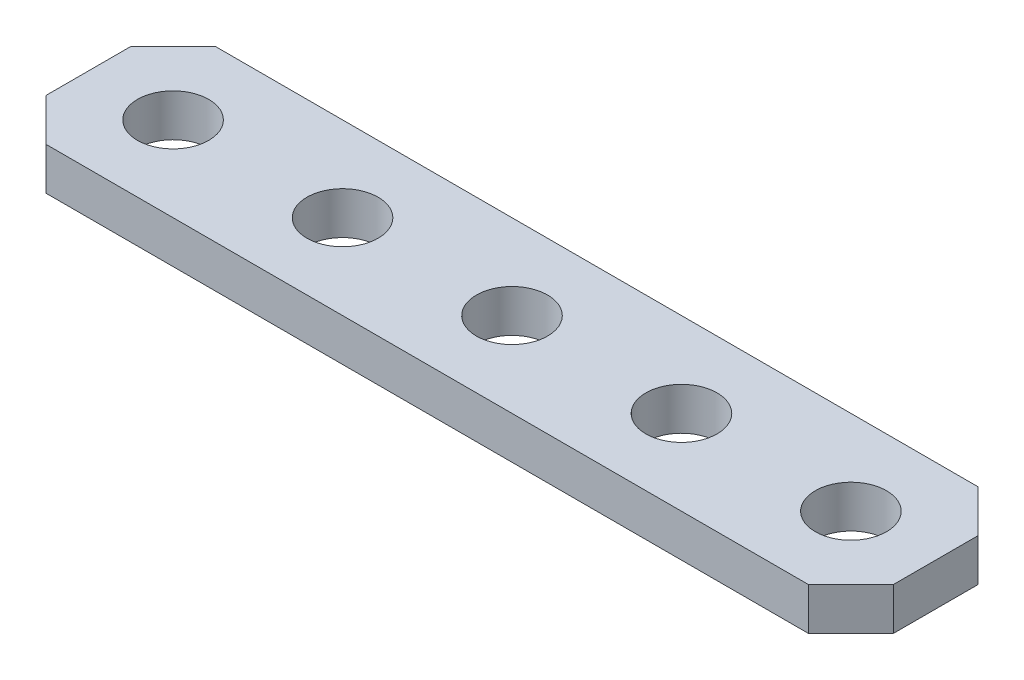
ISO-10303-21;
HEADER;
FILE_DESCRIPTION(('STEP AP214'),'2;1');
FILE_NAME('part.step','',(''),(''),'','','');
FILE_SCHEMA(('AUTOMOTIVE_DESIGN { 1 0 10303 214 1 1 1 1 }'));
ENDSEC;
DATA;
#1=APPLICATION_CONTEXT('core data for automotive mechanical design processes');
#2=APPLICATION_PROTOCOL_DEFINITION('international standard','automotive_design',2000,#1);
#3=PRODUCT_CONTEXT('',#1,'mechanical');
#4=PRODUCT('Part','Part','',(#3));
#5=PRODUCT_RELATED_PRODUCT_CATEGORY('part','',(#4));
#6=PRODUCT_DEFINITION_FORMATION('','',#4);
#7=PRODUCT_DEFINITION_CONTEXT('part definition',#1,'design');
#8=PRODUCT_DEFINITION('design','',#6,#7);
#9=PRODUCT_DEFINITION_SHAPE('','',#8);
#10=(LENGTH_UNIT() NAMED_UNIT(*) SI_UNIT(.MILLI.,.METRE.));
#11=(NAMED_UNIT(*) PLANE_ANGLE_UNIT() SI_UNIT($,.RADIAN.));
#12=(NAMED_UNIT(*) SI_UNIT($,.STERADIAN.) SOLID_ANGLE_UNIT());
#13=UNCERTAINTY_MEASURE_WITH_UNIT(LENGTH_MEASURE(1.E-05),#10,'distance_accuracy_value','');
#14=(GEOMETRIC_REPRESENTATION_CONTEXT(3) GLOBAL_UNCERTAINTY_ASSIGNED_CONTEXT((#13)) GLOBAL_UNIT_ASSIGNED_CONTEXT((#10,
#11,#12)) REPRESENTATION_CONTEXT('',''));
#15=CARTESIAN_POINT('',(0.,0.,0.));
#16=DIRECTION('',(0.,0.,1.));
#17=DIRECTION('',(1.,0.,0.));
#18=AXIS2_PLACEMENT_3D('',#15,#16,#17);
#19=CARTESIAN_POINT('',(0.,3.175,0.));
#20=DIRECTION('',(0.,0.,-1.));
#21=DIRECTION('',(-1.,0.,0.));
#22=AXIS2_PLACEMENT_3D('',#19,#20,#21);
#23=PLANE('',#22);
#24=DIRECTION('',(1.,0.,0.));
#25=VECTOR('',#24,1.);
#26=CARTESIAN_POINT('',(0.,3.175,0.));
#27=LINE('',#26,#25);
#28=CARTESIAN_POINT('',(3.175,3.175,0.));
#29=VERTEX_POINT('',#28);
#30=CARTESIAN_POINT('',(60.325,3.175,0.));
#31=VERTEX_POINT('',#30);
#32=EDGE_CURVE('E121',#29,#31,#27,.T.);
#33=ORIENTED_EDGE('',*,*,#32,.F.);
#34=DIRECTION('',(0.,-1.,0.));
#35=VECTOR('',#34,1.);
#36=CARTESIAN_POINT('',(3.175,0.,0.));
#37=LINE('',#36,#35);
#38=CARTESIAN_POINT('',(3.175,0.,0.));
#39=VERTEX_POINT('',#38);
#40=EDGE_CURVE('E106',#29,#39,#37,.T.);
#41=ORIENTED_EDGE('',*,*,#40,.T.);
#42=DIRECTION('',(1.,0.,0.));
#43=VECTOR('',#42,1.);
#44=CARTESIAN_POINT('',(0.,0.,0.));
#45=LINE('',#44,#43);
#46=CARTESIAN_POINT('',(60.325,0.,0.));
#47=VERTEX_POINT('',#46);
#48=EDGE_CURVE('E118',#39,#47,#45,.T.);
#49=ORIENTED_EDGE('',*,*,#48,.T.);
#50=DIRECTION('',(0.,1.,0.));
#51=VECTOR('',#50,1.);
#52=CARTESIAN_POINT('',(60.325,3.175,0.));
#53=LINE('',#52,#51);
#54=EDGE_CURVE('E123',#47,#31,#53,.T.);
#55=ORIENTED_EDGE('',*,*,#54,.T.);
#56=EDGE_LOOP('',(#33,#41,#49,#55));
#57=FACE_BOUND('',#56,.T.);
#58=ADVANCED_FACE('F36',(#57),#23,.F.);
#59=CARTESIAN_POINT('',(63.5,3.175,0.));
#60=DIRECTION('',(-1.,0.,0.));
#61=DIRECTION('',(0.,0.,1.));
#62=AXIS2_PLACEMENT_3D('',#59,#60,#61);
#63=PLANE('',#62);
#64=DIRECTION('',(0.,0.,-1.));
#65=VECTOR('',#64,1.);
#66=CARTESIAN_POINT('',(63.5,0.,0.));
#67=LINE('',#66,#65);
#68=CARTESIAN_POINT('',(63.5,0.,-3.175));
#69=VERTEX_POINT('',#68);
#70=CARTESIAN_POINT('',(63.5,0.,-9.525));
#71=VERTEX_POINT('',#70);
#72=EDGE_CURVE('E128',#69,#71,#67,.T.);
#73=ORIENTED_EDGE('',*,*,#72,.T.);
#74=DIRECTION('',(0.,1.,0.));
#75=VECTOR('',#74,1.);
#76=CARTESIAN_POINT('',(63.5,3.175,-9.525));
#77=LINE('',#76,#75);
#78=CARTESIAN_POINT('',(63.5,3.175,-9.525));
#79=VERTEX_POINT('',#78);
#80=EDGE_CURVE('E11',#71,#79,#77,.T.);
#81=ORIENTED_EDGE('',*,*,#80,.T.);
#82=DIRECTION('',(0.,0.,-1.));
#83=VECTOR('',#82,1.);
#84=CARTESIAN_POINT('',(63.5,3.175,0.));
#85=LINE('',#84,#83);
#86=CARTESIAN_POINT('',(63.5,3.175,-3.175));
#87=VERTEX_POINT('',#86);
#88=EDGE_CURVE('E172',#87,#79,#85,.T.);
#89=ORIENTED_EDGE('',*,*,#88,.F.);
#90=DIRECTION('',(0.,-1.,0.));
#91=VECTOR('',#90,1.);
#92=CARTESIAN_POINT('',(63.5,3.175,-3.175));
#93=LINE('',#92,#91);
#94=EDGE_CURVE('E44',#87,#69,#93,.T.);
#95=ORIENTED_EDGE('',*,*,#94,.T.);
#96=EDGE_LOOP('',(#73,#81,#89,#95));
#97=FACE_BOUND('',#96,.T.);
#98=ADVANCED_FACE('F170',(#97),#63,.F.);
#99=CARTESIAN_POINT('',(0.,3.175,-12.7));
#100=DIRECTION('',(0.,0.,-1.));
#101=DIRECTION('',(-1.,0.,0.));
#102=AXIS2_PLACEMENT_3D('',#99,#100,#101);
#103=PLANE('',#102);
#104=DIRECTION('',(1.,0.,0.));
#105=VECTOR('',#104,1.);
#106=CARTESIAN_POINT('',(0.,0.,-12.7));
#107=LINE('',#106,#105);
#108=CARTESIAN_POINT('',(3.17500000000001,0.,-12.7));
#109=VERTEX_POINT('',#108);
#110=CARTESIAN_POINT('',(60.325,0.,-12.7));
#111=VERTEX_POINT('',#110);
#112=EDGE_CURVE('E132',#109,#111,#107,.T.);
#113=ORIENTED_EDGE('',*,*,#112,.F.);
#114=DIRECTION('',(0.,1.,0.));
#115=VECTOR('',#114,1.);
#116=CARTESIAN_POINT('',(3.17500000000001,3.175,-12.7));
#117=LINE('',#116,#115);
#118=CARTESIAN_POINT('',(3.17500000000001,3.175,-12.7));
#119=VERTEX_POINT('',#118);
#120=EDGE_CURVE('E58',#109,#119,#117,.T.);
#121=ORIENTED_EDGE('',*,*,#120,.T.);
#122=DIRECTION('',(1.,0.,0.));
#123=VECTOR('',#122,1.);
#124=CARTESIAN_POINT('',(0.,3.175,-12.7));
#125=LINE('',#124,#123);
#126=CARTESIAN_POINT('',(60.325,3.175,-12.7));
#127=VERTEX_POINT('',#126);
#128=EDGE_CURVE('E179',#119,#127,#125,.T.);
#129=ORIENTED_EDGE('',*,*,#128,.T.);
#130=DIRECTION('',(0.,-1.,0.));
#131=VECTOR('',#130,1.);
#132=CARTESIAN_POINT('',(60.325,0.,-12.7));
#133=LINE('',#132,#131);
#134=EDGE_CURVE('E163',#127,#111,#133,.T.);
#135=ORIENTED_EDGE('',*,*,#134,.T.);
#136=EDGE_LOOP('',(#113,#121,#129,#135));
#137=FACE_BOUND('',#136,.T.);
#138=ADVANCED_FACE('F178',(#137),#103,.T.);
#139=CARTESIAN_POINT('',(0.,3.175,0.));
#140=DIRECTION('',(-1.,0.,0.));
#141=DIRECTION('',(0.,0.,1.));
#142=AXIS2_PLACEMENT_3D('',#139,#140,#141);
#143=PLANE('',#142);
#144=DIRECTION('',(0.,0.,-1.));
#145=VECTOR('',#144,1.);
#146=CARTESIAN_POINT('',(0.,0.,0.));
#147=LINE('',#146,#145);
#148=CARTESIAN_POINT('',(0.,0.,-3.17500000000001));
#149=VERTEX_POINT('',#148);
#150=CARTESIAN_POINT('',(0.,0.,-9.525));
#151=VERTEX_POINT('',#150);
#152=EDGE_CURVE('E141',#149,#151,#147,.T.);
#153=ORIENTED_EDGE('',*,*,#152,.F.);
#154=DIRECTION('',(0.,1.,0.));
#155=VECTOR('',#154,1.);
#156=CARTESIAN_POINT('',(0.,3.175,-3.17500000000001));
#157=LINE('',#156,#155);
#158=CARTESIAN_POINT('',(0.,3.175,-3.17500000000001));
#159=VERTEX_POINT('',#158);
#160=EDGE_CURVE('E107',#149,#159,#157,.T.);
#161=ORIENTED_EDGE('',*,*,#160,.T.);
#162=DIRECTION('',(0.,0.,-1.));
#163=VECTOR('',#162,1.);
#164=CARTESIAN_POINT('',(0.,3.175,0.));
#165=LINE('',#164,#163);
#166=CARTESIAN_POINT('',(0.,3.175,-9.525));
#167=VERTEX_POINT('',#166);
#168=EDGE_CURVE('E181',#159,#167,#165,.T.);
#169=ORIENTED_EDGE('',*,*,#168,.T.);
#170=DIRECTION('',(0.,-1.,0.));
#171=VECTOR('',#170,1.);
#172=CARTESIAN_POINT('',(0.,3.175,-9.525));
#173=LINE('',#172,#171);
#174=EDGE_CURVE('E112',#167,#151,#173,.T.);
#175=ORIENTED_EDGE('',*,*,#174,.T.);
#176=EDGE_LOOP('',(#153,#161,#169,#175));
#177=FACE_BOUND('',#176,.T.);
#178=ADVANCED_FACE('F213',(#177),#143,.T.);
#179=CARTESIAN_POINT('',(19.05,3.175,-6.35));
#180=DIRECTION('',(0.,-1.,0.));
#181=DIRECTION('',(0.,0.,-1.));
#182=AXIS2_PLACEMENT_3D('',#179,#180,#181);
#183=CYLINDRICAL_SURFACE('',#182,2.667);
#184=CARTESIAN_POINT('',(19.05,3.175,-6.35));
#185=DIRECTION('',(0.,1.,0.));
#186=DIRECTION('',(0.,0.,1.));
#187=AXIS2_PLACEMENT_3D('',#184,#185,#186);
#188=CIRCLE('',#187,2.667);
#189=CARTESIAN_POINT('',(19.05,3.175,-3.683));
#190=VERTEX_POINT('',#189);
#191=EDGE_CURVE('E253',#190,#190,#188,.T.);
#192=ORIENTED_EDGE('',*,*,#191,.T.);
#193=EDGE_LOOP('',(#192));
#194=FACE_BOUND('',#193,.T.);
#195=CARTESIAN_POINT('',(19.05,0.,-6.35));
#196=DIRECTION('',(0.,1.,0.));
#197=DIRECTION('',(0.,0.,1.));
#198=AXIS2_PLACEMENT_3D('',#195,#196,#197);
#199=CIRCLE('',#198,2.667);
#200=CARTESIAN_POINT('',(19.05,0.,-3.683));
#201=VERTEX_POINT('',#200);
#202=EDGE_CURVE('E129',#201,#201,#199,.T.);
#203=ORIENTED_EDGE('',*,*,#202,.F.);
#204=EDGE_LOOP('',(#203));
#205=FACE_BOUND('',#204,.T.);
#206=ADVANCED_FACE('F203',(#194,#205),#183,.F.);
#207=CARTESIAN_POINT('',(6.35,3.175,-6.35));
#208=DIRECTION('',(0.,-1.,0.));
#209=DIRECTION('',(0.,0.,-1.));
#210=AXIS2_PLACEMENT_3D('',#207,#208,#209);
#211=CYLINDRICAL_SURFACE('',#210,2.667);
#212=CARTESIAN_POINT('',(6.35,3.175,-6.35));
#213=DIRECTION('',(0.,1.,0.));
#214=DIRECTION('',(0.,0.,1.));
#215=AXIS2_PLACEMENT_3D('',#212,#213,#214);
#216=CIRCLE('',#215,2.667);
#217=CARTESIAN_POINT('',(6.35,3.175,-3.683));
#218=VERTEX_POINT('',#217);
#219=EDGE_CURVE('E250',#218,#218,#216,.T.);
#220=ORIENTED_EDGE('',*,*,#219,.T.);
#221=EDGE_LOOP('',(#220));
#222=FACE_BOUND('',#221,.T.);
#223=CARTESIAN_POINT('',(6.35,0.,-6.35));
#224=DIRECTION('',(0.,1.,0.));
#225=DIRECTION('',(0.,0.,1.));
#226=AXIS2_PLACEMENT_3D('',#223,#224,#225);
#227=CIRCLE('',#226,2.667);
#228=CARTESIAN_POINT('',(6.35,0.,-3.683));
#229=VERTEX_POINT('',#228);
#230=EDGE_CURVE('E135',#229,#229,#227,.T.);
#231=ORIENTED_EDGE('',*,*,#230,.F.);
#232=EDGE_LOOP('',(#231));
#233=FACE_BOUND('',#232,.T.);
#234=ADVANCED_FACE('F200',(#222,#233),#211,.F.);
#235=CARTESIAN_POINT('',(57.15,3.175,-6.35));
#236=DIRECTION('',(0.,-1.,0.));
#237=DIRECTION('',(0.,0.,-1.));
#238=AXIS2_PLACEMENT_3D('',#235,#236,#237);
#239=CYLINDRICAL_SURFACE('',#238,2.667);
#240=CARTESIAN_POINT('',(57.15,3.175,-6.35));
#241=DIRECTION('',(0.,1.,0.));
#242=DIRECTION('',(0.,0.,1.));
#243=AXIS2_PLACEMENT_3D('',#240,#241,#242);
#244=CIRCLE('',#243,2.667);
#245=CARTESIAN_POINT('',(57.15,3.175,-3.683));
#246=VERTEX_POINT('',#245);
#247=EDGE_CURVE('E247',#246,#246,#244,.F.);
#248=ORIENTED_EDGE('',*,*,#247,.F.);
#249=EDGE_LOOP('',(#248));
#250=FACE_BOUND('',#249,.T.);
#251=CARTESIAN_POINT('',(57.15,0.,-6.35));
#252=DIRECTION('',(0.,1.,0.));
#253=DIRECTION('',(0.,0.,1.));
#254=AXIS2_PLACEMENT_3D('',#251,#252,#253);
#255=CIRCLE('',#254,2.667);
#256=CARTESIAN_POINT('',(57.15,0.,-3.683));
#257=VERTEX_POINT('',#256);
#258=EDGE_CURVE('E193',#257,#257,#255,.F.);
#259=ORIENTED_EDGE('',*,*,#258,.T.);
#260=EDGE_LOOP('',(#259));
#261=FACE_BOUND('',#260,.T.);
#262=ADVANCED_FACE('F202',(#250,#261),#239,.F.);
#263=CARTESIAN_POINT('',(31.75,3.175,-6.35));
#264=DIRECTION('',(0.,-1.,0.));
#265=DIRECTION('',(0.,0.,-1.));
#266=AXIS2_PLACEMENT_3D('',#263,#264,#265);
#267=CYLINDRICAL_SURFACE('',#266,2.667);
#268=CARTESIAN_POINT('',(31.75,3.175,-6.35));
#269=DIRECTION('',(0.,1.,0.));
#270=DIRECTION('',(0.,0.,1.));
#271=AXIS2_PLACEMENT_3D('',#268,#269,#270);
#272=CIRCLE('',#271,2.667);
#273=CARTESIAN_POINT('',(31.75,3.175,-3.683));
#274=VERTEX_POINT('',#273);
#275=EDGE_CURVE('E146',#274,#274,#272,.T.);
#276=ORIENTED_EDGE('',*,*,#275,.T.);
#277=EDGE_LOOP('',(#276));
#278=FACE_BOUND('',#277,.T.);
#279=CARTESIAN_POINT('',(31.75,0.,-6.35));
#280=DIRECTION('',(0.,1.,0.));
#281=DIRECTION('',(0.,0.,1.));
#282=AXIS2_PLACEMENT_3D('',#279,#280,#281);
#283=CIRCLE('',#282,2.667);
#284=CARTESIAN_POINT('',(31.75,0.,-3.683));
#285=VERTEX_POINT('',#284);
#286=EDGE_CURVE('E190',#285,#285,#283,.T.);
#287=ORIENTED_EDGE('',*,*,#286,.F.);
#288=EDGE_LOOP('',(#287));
#289=FACE_BOUND('',#288,.T.);
#290=ADVANCED_FACE('F210',(#278,#289),#267,.F.);
#291=CARTESIAN_POINT('',(44.45,3.175,-6.35));
#292=DIRECTION('',(0.,-1.,0.));
#293=DIRECTION('',(0.,0.,-1.));
#294=AXIS2_PLACEMENT_3D('',#291,#292,#293);
#295=CYLINDRICAL_SURFACE('',#294,2.667);
#296=CARTESIAN_POINT('',(44.45,3.175,-6.35));
#297=DIRECTION('',(0.,1.,0.));
#298=DIRECTION('',(0.,0.,1.));
#299=AXIS2_PLACEMENT_3D('',#296,#297,#298);
#300=CIRCLE('',#299,2.667);
#301=CARTESIAN_POINT('',(44.45,3.175,-3.683));
#302=VERTEX_POINT('',#301);
#303=EDGE_CURVE('E147',#302,#302,#300,.F.);
#304=ORIENTED_EDGE('',*,*,#303,.F.);
#305=EDGE_LOOP('',(#304));
#306=FACE_BOUND('',#305,.T.);
#307=CARTESIAN_POINT('',(44.45,0.,-6.35));
#308=DIRECTION('',(0.,1.,0.));
#309=DIRECTION('',(0.,0.,1.));
#310=AXIS2_PLACEMENT_3D('',#307,#308,#309);
#311=CIRCLE('',#310,2.667);
#312=CARTESIAN_POINT('',(44.45,0.,-3.683));
#313=VERTEX_POINT('',#312);
#314=EDGE_CURVE('E143',#313,#313,#311,.F.);
#315=ORIENTED_EDGE('',*,*,#314,.T.);
#316=EDGE_LOOP('',(#315));
#317=FACE_BOUND('',#316,.T.);
#318=ADVANCED_FACE('F229',(#306,#317),#295,.F.);
#319=CARTESIAN_POINT('',(0.,3.175,0.));
#320=DIRECTION('',(0.,1.,0.));
#321=DIRECTION('',(0.,0.,1.));
#322=AXIS2_PLACEMENT_3D('',#319,#320,#321);
#323=PLANE('',#322);
#324=ORIENTED_EDGE('',*,*,#275,.F.);
#325=EDGE_LOOP('',(#324));
#326=FACE_BOUND('',#325,.T.);
#327=ORIENTED_EDGE('',*,*,#247,.T.);
#328=EDGE_LOOP('',(#327));
#329=FACE_BOUND('',#328,.T.);
#330=ORIENTED_EDGE('',*,*,#219,.F.);
#331=EDGE_LOOP('',(#330));
#332=FACE_BOUND('',#331,.T.);
#333=ORIENTED_EDGE('',*,*,#191,.F.);
#334=EDGE_LOOP('',(#333));
#335=FACE_BOUND('',#334,.T.);
#336=ORIENTED_EDGE('',*,*,#168,.F.);
#337=DIRECTION('',(0.707106781186547,0.,0.707106781186548));
#338=VECTOR('',#337,1.);
#339=CARTESIAN_POINT('',(1.58750000000001,3.175,-1.5875));
#340=LINE('',#339,#338);
#341=EDGE_CURVE('E161',#159,#29,#340,.T.);
#342=ORIENTED_EDGE('',*,*,#341,.T.);
#343=ORIENTED_EDGE('',*,*,#32,.T.);
#344=DIRECTION('',(-0.707106781186549,0.,0.707106781186546));
#345=VECTOR('',#344,1.);
#346=CARTESIAN_POINT('',(30.1624999999999,3.175,30.1625));
#347=LINE('',#346,#345);
#348=EDGE_CURVE('E156',#31,#87,#347,.F.);
#349=ORIENTED_EDGE('',*,*,#348,.T.);
#350=ORIENTED_EDGE('',*,*,#88,.T.);
#351=DIRECTION('',(-0.707106781186545,0.,-0.70710678118655));
#352=VECTOR('',#351,1.);
#353=CARTESIAN_POINT('',(36.5125000000002,3.175,-36.5125));
#354=LINE('',#353,#352);
#355=EDGE_CURVE('E51',#79,#127,#354,.T.);
#356=ORIENTED_EDGE('',*,*,#355,.T.);
#357=ORIENTED_EDGE('',*,*,#128,.F.);
#358=DIRECTION('',(0.707106781186548,0.,-0.707106781186547));
#359=VECTOR('',#358,1.);
#360=CARTESIAN_POINT('',(-4.7625,3.175,-4.76250000000001));
#361=LINE('',#360,#359);
#362=EDGE_CURVE('E159',#119,#167,#361,.F.);
#363=ORIENTED_EDGE('',*,*,#362,.T.);
#364=EDGE_LOOP('',(#336,#342,#343,#349,#350,#356,#357,#363));
#365=FACE_BOUND('',#364,.T.);
#366=ORIENTED_EDGE('',*,*,#303,.T.);
#367=EDGE_LOOP('',(#366));
#368=FACE_BOUND('',#367,.T.);
#369=ADVANCED_FACE('F232',(#326,#329,#332,#335,#365,#368),#323,.T.);
#370=CARTESIAN_POINT('',(0.,0.,0.));
#371=DIRECTION('',(0.,1.,0.));
#372=DIRECTION('',(0.,0.,1.));
#373=AXIS2_PLACEMENT_3D('',#370,#371,#372);
#374=PLANE('',#373);
#375=ORIENTED_EDGE('',*,*,#286,.T.);
#376=EDGE_LOOP('',(#375));
#377=FACE_BOUND('',#376,.T.);
#378=ORIENTED_EDGE('',*,*,#258,.F.);
#379=EDGE_LOOP('',(#378));
#380=FACE_BOUND('',#379,.T.);
#381=ORIENTED_EDGE('',*,*,#230,.T.);
#382=EDGE_LOOP('',(#381));
#383=FACE_BOUND('',#382,.T.);
#384=ORIENTED_EDGE('',*,*,#202,.T.);
#385=EDGE_LOOP('',(#384));
#386=FACE_BOUND('',#385,.T.);
#387=ORIENTED_EDGE('',*,*,#48,.F.);
#388=DIRECTION('',(-0.707106781186547,0.,-0.707106781186548));
#389=VECTOR('',#388,1.);
#390=CARTESIAN_POINT('',(3.175,0.,0.));
#391=LINE('',#390,#389);
#392=EDGE_CURVE('E102',#39,#149,#391,.T.);
#393=ORIENTED_EDGE('',*,*,#392,.T.);
#394=ORIENTED_EDGE('',*,*,#152,.T.);
#395=DIRECTION('',(-0.707106781186548,0.,0.707106781186547));
#396=VECTOR('',#395,1.);
#397=CARTESIAN_POINT('',(0.,0.,-9.525));
#398=LINE('',#397,#396);
#399=EDGE_CURVE('E113',#151,#109,#398,.F.);
#400=ORIENTED_EDGE('',*,*,#399,.T.);
#401=ORIENTED_EDGE('',*,*,#112,.T.);
#402=DIRECTION('',(0.707106781186545,0.,0.70710678118655));
#403=VECTOR('',#402,1.);
#404=CARTESIAN_POINT('',(60.325,0.,-12.7));
#405=LINE('',#404,#403);
#406=EDGE_CURVE('E150',#111,#71,#405,.T.);
#407=ORIENTED_EDGE('',*,*,#406,.T.);
#408=ORIENTED_EDGE('',*,*,#72,.F.);
#409=DIRECTION('',(0.707106781186549,0.,-0.707106781186546));
#410=VECTOR('',#409,1.);
#411=CARTESIAN_POINT('',(63.5,0.,-3.175));
#412=LINE('',#411,#410);
#413=EDGE_CURVE('E122',#69,#47,#412,.F.);
#414=ORIENTED_EDGE('',*,*,#413,.T.);
#415=EDGE_LOOP('',(#387,#393,#394,#400,#401,#407,#408,#414));
#416=FACE_BOUND('',#415,.T.);
#417=ORIENTED_EDGE('',*,*,#314,.F.);
#418=EDGE_LOOP('',(#417));
#419=FACE_BOUND('',#418,.T.);
#420=ADVANCED_FACE('F125',(#377,#380,#383,#386,#416,#419),#374,.F.);
#421=CARTESIAN_POINT('',(3.175,3.175,0.));
#422=DIRECTION('',(-0.707106781186548,0.,0.707106781186547));
#423=DIRECTION('',(0.,1.,0.));
#424=AXIS2_PLACEMENT_3D('',#421,#422,#423);
#425=PLANE('',#424);
#426=ORIENTED_EDGE('',*,*,#341,.F.);
#427=ORIENTED_EDGE('',*,*,#160,.F.);
#428=ORIENTED_EDGE('',*,*,#392,.F.);
#429=ORIENTED_EDGE('',*,*,#40,.F.);
#430=EDGE_LOOP('',(#426,#427,#428,#429));
#431=FACE_BOUND('',#430,.T.);
#432=ADVANCED_FACE('F105',(#431),#425,.T.);
#433=CARTESIAN_POINT('',(0.,3.175,-9.525));
#434=DIRECTION('',(0.707106781186547,0.,0.707106781186548));
#435=DIRECTION('',(0.,-1.,0.));
#436=AXIS2_PLACEMENT_3D('',#433,#434,#435);
#437=PLANE('',#436);
#438=ORIENTED_EDGE('',*,*,#362,.F.);
#439=ORIENTED_EDGE('',*,*,#120,.F.);
#440=ORIENTED_EDGE('',*,*,#399,.F.);
#441=ORIENTED_EDGE('',*,*,#174,.F.);
#442=EDGE_LOOP('',(#438,#439,#440,#441));
#443=FACE_BOUND('',#442,.T.);
#444=ADVANCED_FACE('F261',(#443),#437,.F.);
#445=CARTESIAN_POINT('',(60.325,3.175,-12.7));
#446=DIRECTION('',(0.70710678118655,0.,-0.707106781186545));
#447=DIRECTION('',(0.,1.,0.));
#448=AXIS2_PLACEMENT_3D('',#445,#446,#447);
#449=PLANE('',#448);
#450=ORIENTED_EDGE('',*,*,#355,.F.);
#451=ORIENTED_EDGE('',*,*,#80,.F.);
#452=ORIENTED_EDGE('',*,*,#406,.F.);
#453=ORIENTED_EDGE('',*,*,#134,.F.);
#454=EDGE_LOOP('',(#450,#451,#452,#453));
#455=FACE_BOUND('',#454,.T.);
#456=ADVANCED_FACE('F177',(#455),#449,.T.);
#457=CARTESIAN_POINT('',(63.5,3.175,-3.175));
#458=DIRECTION('',(-0.707106781186546,0.,-0.707106781186549));
#459=DIRECTION('',(0.,-1.,0.));
#460=AXIS2_PLACEMENT_3D('',#457,#458,#459);
#461=PLANE('',#460);
#462=ORIENTED_EDGE('',*,*,#348,.F.);
#463=ORIENTED_EDGE('',*,*,#54,.F.);
#464=ORIENTED_EDGE('',*,*,#413,.F.);
#465=ORIENTED_EDGE('',*,*,#94,.F.);
#466=EDGE_LOOP('',(#462,#463,#464,#465));
#467=FACE_BOUND('',#466,.T.);
#468=ADVANCED_FACE('F38',(#467),#461,.F.);
#469=CLOSED_SHELL('',(#58,#98,#138,#178,#206,#234,#262,#290,#318,#369,#420,#432,#444,#456,#468));
#470=MANIFOLD_SOLID_BREP('B2',#469);
#471=ADVANCED_BREP_SHAPE_REPRESENTATION('',(#18,#470),#14);
#472=SHAPE_DEFINITION_REPRESENTATION(#9,#471);
ENDSEC;
END-ISO-10303-21;
